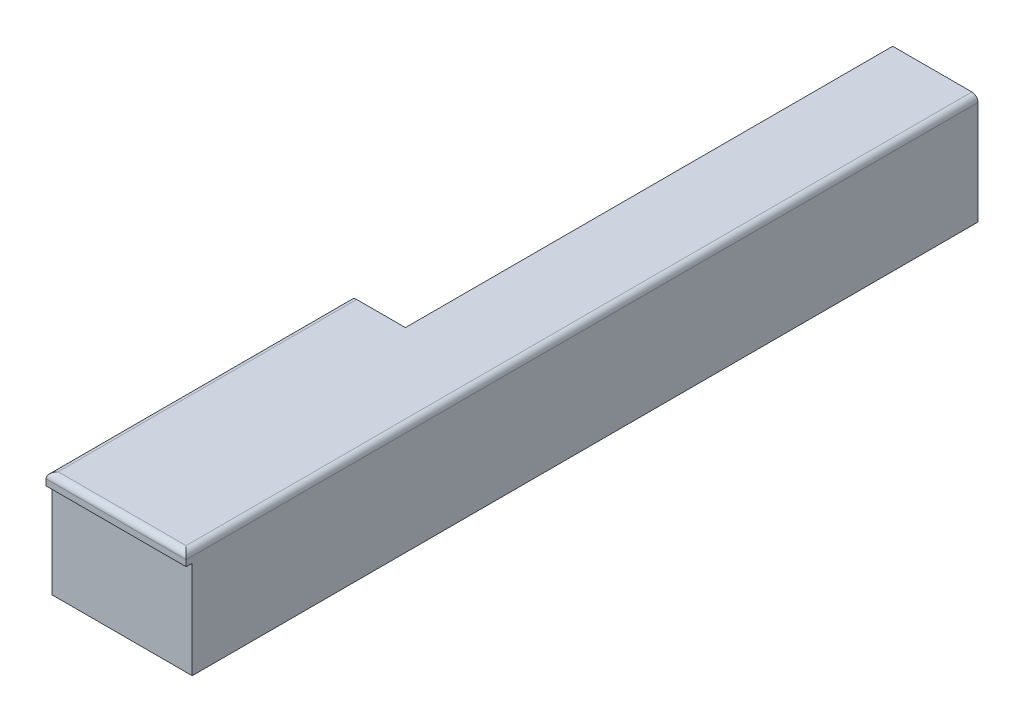
ISO-10303-21;
HEADER;
FILE_DESCRIPTION(('STEP AP214'),'2;1');
FILE_NAME('part.step','',(''),(''),'','','');
FILE_SCHEMA(('AUTOMOTIVE_DESIGN { 1 0 10303 214 1 1 1 1 }'));
ENDSEC;
DATA;
#1=APPLICATION_CONTEXT('core data for automotive mechanical design processes');
#2=APPLICATION_PROTOCOL_DEFINITION('international standard','automotive_design',2000,#1);
#3=PRODUCT_CONTEXT('',#1,'mechanical');
#4=PRODUCT('Part','Part','',(#3));
#5=PRODUCT_RELATED_PRODUCT_CATEGORY('part','',(#4));
#6=PRODUCT_DEFINITION_FORMATION('','',#4);
#7=PRODUCT_DEFINITION_CONTEXT('part definition',#1,'design');
#8=PRODUCT_DEFINITION('design','',#6,#7);
#9=PRODUCT_DEFINITION_SHAPE('','',#8);
#10=(LENGTH_UNIT() NAMED_UNIT(*) SI_UNIT(.MILLI.,.METRE.));
#11=(NAMED_UNIT(*) PLANE_ANGLE_UNIT() SI_UNIT($,.RADIAN.));
#12=(NAMED_UNIT(*) SI_UNIT($,.STERADIAN.) SOLID_ANGLE_UNIT());
#13=UNCERTAINTY_MEASURE_WITH_UNIT(LENGTH_MEASURE(1.E-05),#10,'distance_accuracy_value','');
#14=(GEOMETRIC_REPRESENTATION_CONTEXT(3) GLOBAL_UNCERTAINTY_ASSIGNED_CONTEXT((#13)) GLOBAL_UNIT_ASSIGNED_CONTEXT((#10,
#11,#12)) REPRESENTATION_CONTEXT('',''));
#15=CARTESIAN_POINT('',(0.,0.,0.));
#16=DIRECTION('',(0.,0.,1.));
#17=DIRECTION('',(1.,0.,0.));
#18=AXIS2_PLACEMENT_3D('',#15,#16,#17);
#19=CARTESIAN_POINT('',(0.,18.,-130.));
#20=DIRECTION('',(0.,0.,-1.));
#21=DIRECTION('',(-1.,0.,0.));
#22=AXIS2_PLACEMENT_3D('',#19,#20,#21);
#23=PLANE('',#22);
#24=DIRECTION('',(1.,0.,0.));
#25=VECTOR('',#24,1.);
#26=CARTESIAN_POINT('',(0.,18.,-130.));
#27=LINE('',#26,#25);
#28=CARTESIAN_POINT('',(8.99999999999997,18.,-130.));
#29=VERTEX_POINT('',#28);
#30=CARTESIAN_POINT('',(22.,18.,-130.));
#31=VERTEX_POINT('',#30);
#32=EDGE_CURVE('E140',#29,#31,#27,.T.);
#33=ORIENTED_EDGE('',*,*,#32,.T.);
#34=CARTESIAN_POINT('',(22.,17.,-130.));
#35=DIRECTION('',(0.,0.,-1.));
#36=DIRECTION('',(-1.,0.,0.));
#37=AXIS2_PLACEMENT_3D('',#34,#35,#36);
#38=CIRCLE('',#37,1.);
#39=CARTESIAN_POINT('',(23.,17.,-130.));
#40=VERTEX_POINT('',#39);
#41=EDGE_CURVE('E170',#31,#40,#38,.T.);
#42=ORIENTED_EDGE('',*,*,#41,.T.);
#43=DIRECTION('',(0.,-1.,0.));
#44=VECTOR('',#43,1.);
#45=CARTESIAN_POINT('',(23.,18.,-130.));
#46=LINE('',#45,#44);
#47=CARTESIAN_POINT('',(23.,0.,-130.));
#48=VERTEX_POINT('',#47);
#49=EDGE_CURVE('E150',#40,#48,#46,.T.);
#50=ORIENTED_EDGE('',*,*,#49,.T.);
#51=DIRECTION('',(1.,0.,0.));
#52=VECTOR('',#51,1.);
#53=CARTESIAN_POINT('',(0.,0.,-130.));
#54=LINE('',#53,#52);
#55=CARTESIAN_POINT('',(8.99999999999997,0.,-130.));
#56=VERTEX_POINT('',#55);
#57=EDGE_CURVE('E139',#56,#48,#54,.T.);
#58=ORIENTED_EDGE('',*,*,#57,.F.);
#59=DIRECTION('',(0.,-1.,0.));
#60=VECTOR('',#59,1.);
#61=CARTESIAN_POINT('',(8.99999999999997,18.,-130.));
#62=LINE('',#61,#60);
#63=EDGE_CURVE('E161',#29,#56,#62,.T.);
#64=ORIENTED_EDGE('',*,*,#63,.F.);
#65=EDGE_LOOP('',(#33,#42,#50,#58,#64));
#66=FACE_BOUND('',#65,.T.);
#67=ADVANCED_FACE('F35',(#66),#23,.T.);
#68=CARTESIAN_POINT('',(9.00000000000003,18.,0.));
#69=DIRECTION('',(1.,0.,0.));
#70=DIRECTION('',(0.,0.,-1.));
#71=AXIS2_PLACEMENT_3D('',#68,#69,#70);
#72=PLANE('',#71);
#73=DIRECTION('',(0.,0.,1.));
#74=VECTOR('',#73,1.);
#75=CARTESIAN_POINT('',(9.00000000000003,0.,0.));
#76=LINE('',#75,#74);
#77=CARTESIAN_POINT('',(9.00000000000001,0.,-50.));
#78=VERTEX_POINT('',#77);
#79=EDGE_CURVE('E201',#56,#78,#76,.T.);
#80=ORIENTED_EDGE('',*,*,#79,.T.);
#81=DIRECTION('',(0.,-1.,0.));
#82=VECTOR('',#81,1.);
#83=CARTESIAN_POINT('',(9.00000000000001,18.,-50.));
#84=LINE('',#83,#82);
#85=CARTESIAN_POINT('',(9.00000000000001,18.,-50.));
#86=VERTEX_POINT('',#85);
#87=EDGE_CURVE('E159',#86,#78,#84,.T.);
#88=ORIENTED_EDGE('',*,*,#87,.F.);
#89=DIRECTION('',(0.,0.,1.));
#90=VECTOR('',#89,1.);
#91=CARTESIAN_POINT('',(9.00000000000003,18.,0.));
#92=LINE('',#91,#90);
#93=EDGE_CURVE('E144',#29,#86,#92,.T.);
#94=ORIENTED_EDGE('',*,*,#93,.F.);
#95=ORIENTED_EDGE('',*,*,#63,.T.);
#96=EDGE_LOOP('',(#80,#88,#94,#95));
#97=FACE_BOUND('',#96,.T.);
#98=ADVANCED_FACE('F212',(#97),#72,.F.);
#99=CARTESIAN_POINT('',(0.,18.,-50.));
#100=DIRECTION('',(0.,0.,-1.));
#101=DIRECTION('',(-1.,0.,0.));
#102=AXIS2_PLACEMENT_3D('',#99,#100,#101);
#103=PLANE('',#102);
#104=DIRECTION('',(0.,-1.,0.));
#105=VECTOR('',#104,1.);
#106=CARTESIAN_POINT('',(0.,18.,-50.));
#107=LINE('',#106,#105);
#108=CARTESIAN_POINT('',(0.,17.,-50.));
#109=VERTEX_POINT('',#108);
#110=CARTESIAN_POINT('',(0.,0.,-50.));
#111=VERTEX_POINT('',#110);
#112=EDGE_CURVE('E157',#109,#111,#107,.T.);
#113=ORIENTED_EDGE('',*,*,#112,.F.);
#114=CARTESIAN_POINT('',(1.,17.,-50.));
#115=DIRECTION('',(0.,0.,-1.));
#116=DIRECTION('',(-1.,0.,0.));
#117=AXIS2_PLACEMENT_3D('',#114,#115,#116);
#118=CIRCLE('',#117,1.);
#119=CARTESIAN_POINT('',(1.,18.,-50.));
#120=VERTEX_POINT('',#119);
#121=EDGE_CURVE('E44',#109,#120,#118,.T.);
#122=ORIENTED_EDGE('',*,*,#121,.T.);
#123=DIRECTION('',(1.,0.,0.));
#124=VECTOR('',#123,1.);
#125=CARTESIAN_POINT('',(0.,18.,-50.));
#126=LINE('',#125,#124);
#127=EDGE_CURVE('E153',#120,#86,#126,.T.);
#128=ORIENTED_EDGE('',*,*,#127,.T.);
#129=ORIENTED_EDGE('',*,*,#87,.T.);
#130=DIRECTION('',(1.,0.,0.));
#131=VECTOR('',#130,1.);
#132=CARTESIAN_POINT('',(0.,0.,-50.));
#133=LINE('',#132,#131);
#134=EDGE_CURVE('E146',#111,#78,#133,.T.);
#135=ORIENTED_EDGE('',*,*,#134,.F.);
#136=EDGE_LOOP('',(#113,#122,#128,#129,#135));
#137=FACE_BOUND('',#136,.T.);
#138=ADVANCED_FACE('F206',(#137),#103,.T.);
#139=CARTESIAN_POINT('',(0.,18.,0.));
#140=DIRECTION('',(-1.,0.,0.));
#141=DIRECTION('',(0.,0.,1.));
#142=AXIS2_PLACEMENT_3D('',#139,#140,#141);
#143=PLANE('',#142);
#144=DIRECTION('',(0.,-1.,0.));
#145=VECTOR('',#144,1.);
#146=CARTESIAN_POINT('',(0.,18.,0.));
#147=LINE('',#146,#145);
#148=CARTESIAN_POINT('',(0.,17.,0.));
#149=VERTEX_POINT('',#148);
#150=CARTESIAN_POINT('',(0.,16.,0.));
#151=VERTEX_POINT('',#150);
#152=EDGE_CURVE('E155',#149,#151,#147,.T.);
#153=ORIENTED_EDGE('',*,*,#152,.F.);
#154=DIRECTION('',(0.,0.,-1.));
#155=VECTOR('',#154,1.);
#156=CARTESIAN_POINT('',(0.,17.,0.));
#157=LINE('',#156,#155);
#158=EDGE_CURVE('E52',#149,#109,#157,.T.);
#159=ORIENTED_EDGE('',*,*,#158,.T.);
#160=ORIENTED_EDGE('',*,*,#112,.T.);
#161=DIRECTION('',(0.,0.,-1.));
#162=VECTOR('',#161,1.);
#163=CARTESIAN_POINT('',(0.,0.,0.));
#164=LINE('',#163,#162);
#165=CARTESIAN_POINT('',(0.,0.,-1.));
#166=VERTEX_POINT('',#165);
#167=EDGE_CURVE('E141',#166,#111,#164,.T.);
#168=ORIENTED_EDGE('',*,*,#167,.F.);
#169=DIRECTION('',(0.,-1.,0.));
#170=VECTOR('',#169,1.);
#171=CARTESIAN_POINT('',(0.,0.,-1.));
#172=LINE('',#171,#170);
#173=CARTESIAN_POINT('',(0.,16.,-1.));
#174=VERTEX_POINT('',#173);
#175=EDGE_CURVE('E119',#174,#166,#172,.T.);
#176=ORIENTED_EDGE('',*,*,#175,.F.);
#177=DIRECTION('',(0.,0.,1.));
#178=VECTOR('',#177,1.);
#179=CARTESIAN_POINT('',(0.,16.,-1.));
#180=LINE('',#179,#178);
#181=EDGE_CURVE('E194',#174,#151,#180,.T.);
#182=ORIENTED_EDGE('',*,*,#181,.T.);
#183=EDGE_LOOP('',(#153,#159,#160,#168,#176,#182));
#184=FACE_BOUND('',#183,.T.);
#185=ADVANCED_FACE('F236',(#184),#143,.T.);
#186=CARTESIAN_POINT('',(0.,18.,0.));
#187=DIRECTION('',(0.,0.,-1.));
#188=DIRECTION('',(-1.,0.,0.));
#189=AXIS2_PLACEMENT_3D('',#186,#187,#188);
#190=PLANE('',#189);
#191=DIRECTION('',(0.,-1.,0.));
#192=VECTOR('',#191,1.);
#193=CARTESIAN_POINT('',(23.,18.,0.));
#194=LINE('',#193,#192);
#195=CARTESIAN_POINT('',(23.,17.,0.));
#196=VERTEX_POINT('',#195);
#197=CARTESIAN_POINT('',(23.,16.,0.));
#198=VERTEX_POINT('',#197);
#199=EDGE_CURVE('E152',#196,#198,#194,.T.);
#200=ORIENTED_EDGE('',*,*,#199,.F.);
#201=DIRECTION('',(1.,0.,0.));
#202=VECTOR('',#201,1.);
#203=CARTESIAN_POINT('',(0.,17.,0.));
#204=LINE('',#203,#202);
#205=EDGE_CURVE('E11',#196,#149,#204,.F.);
#206=ORIENTED_EDGE('',*,*,#205,.T.);
#207=ORIENTED_EDGE('',*,*,#152,.T.);
#208=DIRECTION('',(-1.,0.,0.));
#209=VECTOR('',#208,1.);
#210=CARTESIAN_POINT('',(0.,16.,0.));
#211=LINE('',#210,#209);
#212=EDGE_CURVE('E182',#198,#151,#211,.T.);
#213=ORIENTED_EDGE('',*,*,#212,.F.);
#214=EDGE_LOOP('',(#200,#206,#207,#213));
#215=FACE_BOUND('',#214,.T.);
#216=ADVANCED_FACE('F239',(#215),#190,.F.);
#217=CARTESIAN_POINT('',(23.,18.,0.));
#218=DIRECTION('',(-1.,0.,0.));
#219=DIRECTION('',(0.,0.,1.));
#220=AXIS2_PLACEMENT_3D('',#217,#218,#219);
#221=PLANE('',#220);
#222=ORIENTED_EDGE('',*,*,#49,.F.);
#223=DIRECTION('',(0.,0.,-1.));
#224=VECTOR('',#223,1.);
#225=CARTESIAN_POINT('',(23.,17.,0.));
#226=LINE('',#225,#224);
#227=EDGE_CURVE('E172',#40,#196,#226,.F.);
#228=ORIENTED_EDGE('',*,*,#227,.T.);
#229=ORIENTED_EDGE('',*,*,#199,.T.);
#230=DIRECTION('',(0.,0.,1.));
#231=VECTOR('',#230,1.);
#232=CARTESIAN_POINT('',(23.,16.,-1.));
#233=LINE('',#232,#231);
#234=CARTESIAN_POINT('',(23.,16.,-1.));
#235=VERTEX_POINT('',#234);
#236=EDGE_CURVE('E133',#235,#198,#233,.T.);
#237=ORIENTED_EDGE('',*,*,#236,.F.);
#238=DIRECTION('',(0.,1.,0.));
#239=VECTOR('',#238,1.);
#240=CARTESIAN_POINT('',(23.,0.,-1.));
#241=LINE('',#240,#239);
#242=CARTESIAN_POINT('',(23.,0.,-1.));
#243=VERTEX_POINT('',#242);
#244=EDGE_CURVE('E116',#243,#235,#241,.T.);
#245=ORIENTED_EDGE('',*,*,#244,.F.);
#246=DIRECTION('',(0.,0.,-1.));
#247=VECTOR('',#246,1.);
#248=CARTESIAN_POINT('',(23.,0.,0.));
#249=LINE('',#248,#247);
#250=EDGE_CURVE('E130',#243,#48,#249,.T.);
#251=ORIENTED_EDGE('',*,*,#250,.T.);
#252=EDGE_LOOP('',(#222,#228,#229,#237,#245,#251));
#253=FACE_BOUND('',#252,.T.);
#254=ADVANCED_FACE('F129',(#253),#221,.F.);
#255=CARTESIAN_POINT('',(0.,18.,0.));
#256=DIRECTION('',(0.,1.,0.));
#257=DIRECTION('',(0.,0.,1.));
#258=AXIS2_PLACEMENT_3D('',#255,#256,#257);
#259=PLANE('',#258);
#260=DIRECTION('',(1.,0.,0.));
#261=VECTOR('',#260,1.);
#262=CARTESIAN_POINT('',(23.,18.,-1.));
#263=LINE('',#262,#261);
#264=CARTESIAN_POINT('',(1.,18.,-1.));
#265=VERTEX_POINT('',#264);
#266=CARTESIAN_POINT('',(22.,18.,-1.));
#267=VERTEX_POINT('',#266);
#268=EDGE_CURVE('E163',#265,#267,#263,.T.);
#269=ORIENTED_EDGE('',*,*,#268,.T.);
#270=DIRECTION('',(0.,0.,-1.));
#271=VECTOR('',#270,1.);
#272=CARTESIAN_POINT('',(22.,18.,-130.));
#273=LINE('',#272,#271);
#274=EDGE_CURVE('E167',#267,#31,#273,.T.);
#275=ORIENTED_EDGE('',*,*,#274,.T.);
#276=ORIENTED_EDGE('',*,*,#32,.F.);
#277=ORIENTED_EDGE('',*,*,#93,.T.);
#278=ORIENTED_EDGE('',*,*,#127,.F.);
#279=DIRECTION('',(0.,0.,-1.));
#280=VECTOR('',#279,1.);
#281=CARTESIAN_POINT('',(1.,18.,0.));
#282=LINE('',#281,#280);
#283=EDGE_CURVE('E165',#120,#265,#282,.F.);
#284=ORIENTED_EDGE('',*,*,#283,.T.);
#285=EDGE_LOOP('',(#269,#275,#276,#277,#278,#284));
#286=FACE_BOUND('',#285,.T.);
#287=ADVANCED_FACE('F217',(#286),#259,.T.);
#288=CARTESIAN_POINT('',(0.,0.,0.));
#289=DIRECTION('',(0.,1.,0.));
#290=DIRECTION('',(0.,0.,1.));
#291=AXIS2_PLACEMENT_3D('',#288,#289,#290);
#292=PLANE('',#291);
#293=ORIENTED_EDGE('',*,*,#250,.F.);
#294=DIRECTION('',(1.,0.,0.));
#295=VECTOR('',#294,1.);
#296=CARTESIAN_POINT('',(0.,0.,-1.));
#297=LINE('',#296,#295);
#298=EDGE_CURVE('E112',#166,#243,#297,.T.);
#299=ORIENTED_EDGE('',*,*,#298,.F.);
#300=ORIENTED_EDGE('',*,*,#167,.T.);
#301=ORIENTED_EDGE('',*,*,#134,.T.);
#302=ORIENTED_EDGE('',*,*,#79,.F.);
#303=ORIENTED_EDGE('',*,*,#57,.T.);
#304=EDGE_LOOP('',(#293,#299,#300,#301,#302,#303));
#305=FACE_BOUND('',#304,.T.);
#306=ADVANCED_FACE('F136',(#305),#292,.F.);
#307=CARTESIAN_POINT('',(0.,16.,-1.));
#308=DIRECTION('',(0.,1.,0.));
#309=DIRECTION('',(0.,0.,1.));
#310=AXIS2_PLACEMENT_3D('',#307,#308,#309);
#311=PLANE('',#310);
#312=ORIENTED_EDGE('',*,*,#212,.T.);
#313=ORIENTED_EDGE('',*,*,#181,.F.);
#314=DIRECTION('',(-1.,0.,0.));
#315=VECTOR('',#314,1.);
#316=CARTESIAN_POINT('',(0.,16.,-1.));
#317=LINE('',#316,#315);
#318=EDGE_CURVE('E134',#235,#174,#317,.T.);
#319=ORIENTED_EDGE('',*,*,#318,.F.);
#320=ORIENTED_EDGE('',*,*,#236,.T.);
#321=EDGE_LOOP('',(#312,#313,#319,#320));
#322=FACE_BOUND('',#321,.T.);
#323=ADVANCED_FACE('F246',(#322),#311,.F.);
#324=CARTESIAN_POINT('',(0.,0.,-1.));
#325=DIRECTION('',(0.,0.,-1.));
#326=DIRECTION('',(-1.,0.,0.));
#327=AXIS2_PLACEMENT_3D('',#324,#325,#326);
#328=PLANE('',#327);
#329=ORIENTED_EDGE('',*,*,#175,.T.);
#330=ORIENTED_EDGE('',*,*,#298,.T.);
#331=ORIENTED_EDGE('',*,*,#244,.T.);
#332=ORIENTED_EDGE('',*,*,#318,.T.);
#333=EDGE_LOOP('',(#329,#330,#331,#332));
#334=FACE_BOUND('',#333,.T.);
#335=ADVANCED_FACE('F114',(#334),#328,.F.);
#336=CARTESIAN_POINT('',(1.,17.,0.));
#337=DIRECTION('',(0.,0.,-1.));
#338=DIRECTION('',(-1.,0.,0.));
#339=AXIS2_PLACEMENT_3D('',#336,#337,#338);
#340=CYLINDRICAL_SURFACE('',#339,1.);
#341=ORIENTED_EDGE('',*,*,#121,.F.);
#342=ORIENTED_EDGE('',*,*,#158,.F.);
#343=CARTESIAN_POINT('',(1.,17.,-1.));
#344=DIRECTION('',(-0.707106781186547,0.,-0.707106781186547));
#345=DIRECTION('',(-0.707106781186547,0.,0.707106781186547));
#346=AXIS2_PLACEMENT_3D('',#343,#344,#345);
#347=ELLIPSE('',#346,1.41421356237309,1.);
#348=EDGE_CURVE('E39',#265,#149,#347,.F.);
#349=ORIENTED_EDGE('',*,*,#348,.F.);
#350=ORIENTED_EDGE('',*,*,#283,.F.);
#351=EDGE_LOOP('',(#341,#342,#349,#350));
#352=FACE_BOUND('',#351,.T.);
#353=ADVANCED_FACE('F37',(#352),#340,.T.);
#354=CARTESIAN_POINT('',(0.,17.,-1.));
#355=DIRECTION('',(-1.,0.,0.));
#356=DIRECTION('',(0.,0.,1.));
#357=AXIS2_PLACEMENT_3D('',#354,#355,#356);
#358=CYLINDRICAL_SURFACE('',#357,1.);
#359=ORIENTED_EDGE('',*,*,#348,.T.);
#360=ORIENTED_EDGE('',*,*,#205,.F.);
#361=CARTESIAN_POINT('',(22.,17.,-1.));
#362=DIRECTION('',(-0.707106781186547,0.,0.707106781186548));
#363=DIRECTION('',(-0.707106781186548,0.,-0.707106781186547));
#364=AXIS2_PLACEMENT_3D('',#361,#362,#363);
#365=ELLIPSE('',#364,1.4142135623731,1.);
#366=EDGE_CURVE('E175',#267,#196,#365,.F.);
#367=ORIENTED_EDGE('',*,*,#366,.F.);
#368=ORIENTED_EDGE('',*,*,#268,.F.);
#369=EDGE_LOOP('',(#359,#360,#367,#368));
#370=FACE_BOUND('',#369,.T.);
#371=ADVANCED_FACE('F219',(#370),#358,.T.);
#372=CARTESIAN_POINT('',(22.,17.,0.));
#373=DIRECTION('',(0.,0.,1.));
#374=DIRECTION('',(1.,0.,0.));
#375=AXIS2_PLACEMENT_3D('',#372,#373,#374);
#376=CYLINDRICAL_SURFACE('',#375,1.);
#377=ORIENTED_EDGE('',*,*,#366,.T.);
#378=ORIENTED_EDGE('',*,*,#227,.F.);
#379=ORIENTED_EDGE('',*,*,#41,.F.);
#380=ORIENTED_EDGE('',*,*,#274,.F.);
#381=EDGE_LOOP('',(#377,#378,#379,#380));
#382=FACE_BOUND('',#381,.T.);
#383=ADVANCED_FACE('F215',(#382),#376,.T.);
#384=CLOSED_SHELL('',(#67,#98,#138,#185,#216,#254,#287,#306,#323,#335,#353,#371,#383));
#385=MANIFOLD_SOLID_BREP('B2',#384);
#386=ADVANCED_BREP_SHAPE_REPRESENTATION('',(#18,#385),#14);
#387=SHAPE_DEFINITION_REPRESENTATION(#9,#386);
ENDSEC;
END-ISO-10303-21;
